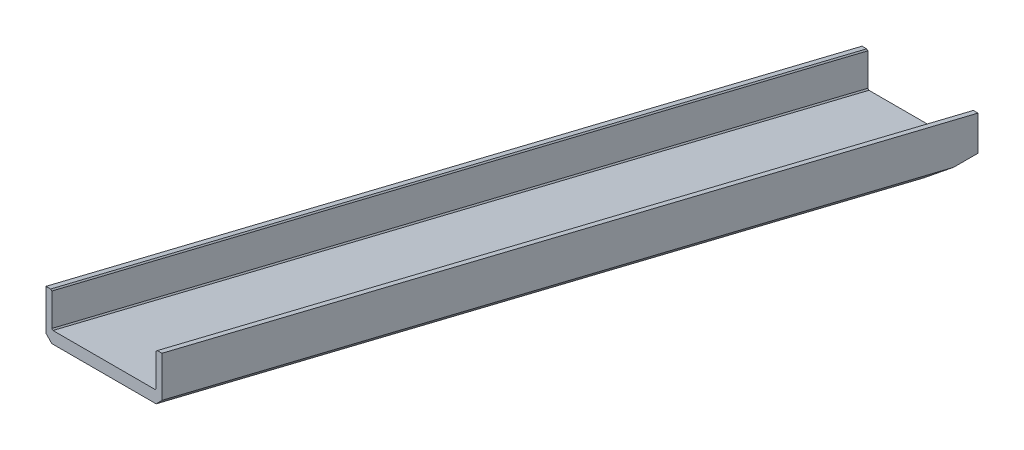
ISO-10303-21;
HEADER;
FILE_DESCRIPTION(('STEP AP214'),'2;1');
FILE_NAME('part.step','',(''),(''),'','','');
FILE_SCHEMA(('AUTOMOTIVE_DESIGN { 1 0 10303 214 1 1 1 1 }'));
ENDSEC;
DATA;
#1=APPLICATION_CONTEXT('core data for automotive mechanical design processes');
#2=APPLICATION_PROTOCOL_DEFINITION('international standard','automotive_design',2000,#1);
#3=PRODUCT_CONTEXT('',#1,'mechanical');
#4=PRODUCT('Part','Part','',(#3));
#5=PRODUCT_RELATED_PRODUCT_CATEGORY('part','',(#4));
#6=PRODUCT_DEFINITION_FORMATION('','',#4);
#7=PRODUCT_DEFINITION_CONTEXT('part definition',#1,'design');
#8=PRODUCT_DEFINITION('design','',#6,#7);
#9=PRODUCT_DEFINITION_SHAPE('','',#8);
#10=(LENGTH_UNIT() NAMED_UNIT(*) SI_UNIT(.MILLI.,.METRE.));
#11=(NAMED_UNIT(*) PLANE_ANGLE_UNIT() SI_UNIT($,.RADIAN.));
#12=(NAMED_UNIT(*) SI_UNIT($,.STERADIAN.) SOLID_ANGLE_UNIT());
#13=UNCERTAINTY_MEASURE_WITH_UNIT(LENGTH_MEASURE(1.E-05),#10,'distance_accuracy_value','');
#14=(GEOMETRIC_REPRESENTATION_CONTEXT(3) GLOBAL_UNCERTAINTY_ASSIGNED_CONTEXT((#13)) GLOBAL_UNIT_ASSIGNED_CONTEXT((#10,
#11,#12)) REPRESENTATION_CONTEXT('',''));
#15=CARTESIAN_POINT('',(0.,0.,0.));
#16=DIRECTION('',(0.,0.,1.));
#17=DIRECTION('',(1.,0.,0.));
#18=AXIS2_PLACEMENT_3D('',#15,#16,#17);
#19=CARTESIAN_POINT('',(450.,-4000.,2700.));
#20=DIRECTION('',(0.,-0.971250682234017,0.238059052043723));
#21=DIRECTION('',(0.,-0.238059052043723,-0.971250682234017));
#22=AXIS2_PLACEMENT_3D('',#19,#20,#21);
#23=PLANE('',#22);
#24=DIRECTION('',(-1.,0.,0.));
#25=VECTOR('',#24,1.);
#26=CARTESIAN_POINT('',(450.,-2274.99999999998,9737.7808046803));
#27=LINE('',#26,#25);
#28=CARTESIAN_POINT('',(439.999999999999,-2274.99999999998,9737.7808046803));
#29=VERTEX_POINT('',#28);
#30=CARTESIAN_POINT('',(-439.999999999999,-2274.99999999998,9737.7808046803));
#31=VERTEX_POINT('',#30);
#32=EDGE_CURVE('E287',#29,#31,#27,.T.);
#33=ORIENTED_EDGE('',*,*,#32,.F.);
#34=DIRECTION('',(0.,-0.238059052043723,-0.971250682234017));
#35=VECTOR('',#34,1.);
#36=CARTESIAN_POINT('',(439.999999999999,-4000.,2700.));
#37=LINE('',#36,#35);
#38=CARTESIAN_POINT('',(439.999999999999,-4000.,2700.));
#39=VERTEX_POINT('',#38);
#40=EDGE_CURVE('E294',#29,#39,#37,.T.);
#41=ORIENTED_EDGE('',*,*,#40,.T.);
#42=DIRECTION('',(-1.,0.,0.));
#43=VECTOR('',#42,1.);
#44=CARTESIAN_POINT('',(450.,-4000.,2700.));
#45=LINE('',#44,#43);
#46=CARTESIAN_POINT('',(-439.999999999999,-4000.,2700.));
#47=VERTEX_POINT('',#46);
#48=EDGE_CURVE('E278',#39,#47,#45,.T.);
#49=ORIENTED_EDGE('',*,*,#48,.T.);
#50=DIRECTION('',(0.,-0.238059052043723,-0.971250682234017));
#51=VECTOR('',#50,1.);
#52=CARTESIAN_POINT('',(-439.999999999999,-4000.,2700.));
#53=LINE('',#52,#51);
#54=EDGE_CURVE('E212',#31,#47,#53,.T.);
#55=ORIENTED_EDGE('',*,*,#54,.F.);
#56=EDGE_LOOP('',(#33,#41,#49,#55));
#57=FACE_BOUND('',#56,.T.);
#58=ADVANCED_FACE('F49',(#57),#23,.F.);
#59=CARTESIAN_POINT('',(450.,-2274.99999999998,9737.7808046803));
#60=DIRECTION('',(0.,0.,-1.));
#61=DIRECTION('',(-1.,0.,0.));
#62=AXIS2_PLACEMENT_3D('',#59,#60,#61);
#63=PLANE('',#62);
#64=DIRECTION('',(-1.,0.,0.));
#65=VECTOR('',#64,1.);
#66=CARTESIAN_POINT('',(500.,-1974.99999999998,9737.7808046803));
#67=LINE('',#66,#65);
#68=CARTESIAN_POINT('',(500.,-1974.99999999998,9737.7808046803));
#69=VERTEX_POINT('',#68);
#70=CARTESIAN_POINT('',(459.999999999999,-1974.99999999998,9737.7808046803));
#71=VERTEX_POINT('',#70);
#72=EDGE_CURVE('E264',#69,#71,#67,.T.);
#73=ORIENTED_EDGE('',*,*,#72,.T.);
#74=DIRECTION('',(0.696720028549396,0.71734315485556,0.));
#75=VECTOR('',#74,1.);
#76=CARTESIAN_POINT('',(-402.133167245435,-2862.65257313626,9737.7808046803));
#77=LINE('',#76,#75);
#78=CARTESIAN_POINT('',(450.,-1985.29600306378,9737.7808046803));
#79=VERTEX_POINT('',#78);
#80=EDGE_CURVE('E73',#71,#79,#77,.F.);
#81=ORIENTED_EDGE('',*,*,#80,.T.);
#82=DIRECTION('',(0.,-1.,0.));
#83=VECTOR('',#82,1.);
#84=CARTESIAN_POINT('',(450.,-1974.99999999998,9737.7808046803));
#85=LINE('',#84,#83);
#86=CARTESIAN_POINT('',(450.,-2264.70399693618,9737.7808046803));
#87=VERTEX_POINT('',#86);
#88=EDGE_CURVE('E254',#79,#87,#85,.T.);
#89=ORIENTED_EDGE('',*,*,#88,.T.);
#90=DIRECTION('',(0.696720028549376,0.71734315485558,0.));
#91=VECTOR('',#90,1.);
#92=CARTESIAN_POINT('',(444.854187981818,-2270.00212656667,9737.7808046803));
#93=LINE('',#92,#91);
#94=EDGE_CURVE('E298',#87,#29,#93,.F.);
#95=ORIENTED_EDGE('',*,*,#94,.T.);
#96=ORIENTED_EDGE('',*,*,#32,.T.);
#97=DIRECTION('',(-0.696720028549376,0.71734315485558,0.));
#98=VECTOR('',#97,1.);
#99=CARTESIAN_POINT('',(-444.854187981818,-2270.00212656667,9737.7808046803));
#100=LINE('',#99,#98);
#101=CARTESIAN_POINT('',(-450.,-2264.70399693618,9737.7808046803));
#102=VERTEX_POINT('',#101);
#103=EDGE_CURVE('E215',#102,#31,#100,.F.);
#104=ORIENTED_EDGE('',*,*,#103,.F.);
#105=DIRECTION('',(0.,-1.,0.));
#106=VECTOR('',#105,1.);
#107=CARTESIAN_POINT('',(-450.,-1974.99999999998,9737.7808046803));
#108=LINE('',#107,#106);
#109=CARTESIAN_POINT('',(-450.,-1985.29600306378,9737.7808046803));
#110=VERTEX_POINT('',#109);
#111=EDGE_CURVE('E188',#110,#102,#108,.T.);
#112=ORIENTED_EDGE('',*,*,#111,.F.);
#113=DIRECTION('',(-0.696720028549396,0.71734315485556,0.));
#114=VECTOR('',#113,1.);
#115=CARTESIAN_POINT('',(402.133167245435,-2862.65257313626,9737.7808046803));
#116=LINE('',#115,#114);
#117=CARTESIAN_POINT('',(-459.999999999999,-1974.99999999998,9737.7808046803));
#118=VERTEX_POINT('',#117);
#119=EDGE_CURVE('E237',#118,#110,#116,.F.);
#120=ORIENTED_EDGE('',*,*,#119,.F.);
#121=DIRECTION('',(1.,0.,0.));
#122=VECTOR('',#121,1.);
#123=CARTESIAN_POINT('',(-500.,-1974.99999999998,9737.7808046803));
#124=LINE('',#123,#122);
#125=CARTESIAN_POINT('',(-500.,-1974.99999999998,9737.7808046803));
#126=VERTEX_POINT('',#125);
#127=EDGE_CURVE('E201',#126,#118,#124,.T.);
#128=ORIENTED_EDGE('',*,*,#127,.F.);
#129=DIRECTION('',(0.,-1.,0.));
#130=VECTOR('',#129,1.);
#131=CARTESIAN_POINT('',(-500.,-1974.99999999998,9737.7808046803));
#132=LINE('',#131,#130);
#133=CARTESIAN_POINT('',(-500.,-2326.48001531898,9737.7808046803));
#134=VERTEX_POINT('',#133);
#135=EDGE_CURVE('E197',#126,#134,#132,.T.);
#136=ORIENTED_EDGE('',*,*,#135,.T.);
#137=DIRECTION('',(-0.69672002854938,0.717343154855576,0.));
#138=VECTOR('',#137,1.);
#139=CARTESIAN_POINT('',(559.386544490562,-3417.22472610139,9737.7808046803));
#140=LINE('',#139,#138);
#141=CARTESIAN_POINT('',(-450.000000000002,-2377.96003063799,9737.7808046803));
#142=VERTEX_POINT('',#141);
#143=EDGE_CURVE('E230',#142,#134,#140,.T.);
#144=ORIENTED_EDGE('',*,*,#143,.F.);
#145=DIRECTION('',(-1.,0.,0.));
#146=VECTOR('',#145,1.);
#147=CARTESIAN_POINT('',(450.,-2377.96003063799,9737.7808046803));
#148=LINE('',#147,#146);
#149=CARTESIAN_POINT('',(450.000000000002,-2377.96003063799,9737.7808046803));
#150=VERTEX_POINT('',#149);
#151=EDGE_CURVE('E284',#150,#142,#148,.T.);
#152=ORIENTED_EDGE('',*,*,#151,.F.);
#153=DIRECTION('',(0.69672002854938,0.717343154855576,0.));
#154=VECTOR('',#153,1.);
#155=CARTESIAN_POINT('',(-559.386544490562,-3417.22472610139,9737.7808046803));
#156=LINE('',#155,#154);
#157=CARTESIAN_POINT('',(500.,-2326.48001531898,9737.7808046803));
#158=VERTEX_POINT('',#157);
#159=EDGE_CURVE('E314',#150,#158,#156,.T.);
#160=ORIENTED_EDGE('',*,*,#159,.T.);
#161=DIRECTION('',(0.,-1.,0.));
#162=VECTOR('',#161,1.);
#163=CARTESIAN_POINT('',(500.,-1974.99999999998,9737.7808046803));
#164=LINE('',#163,#162);
#165=EDGE_CURVE('E260',#69,#158,#164,.T.);
#166=ORIENTED_EDGE('',*,*,#165,.F.);
#167=EDGE_LOOP('',(#73,#81,#89,#95,#96,#104,#112,#120,#128,#136,#144,#152,#160,#166));
#168=FACE_BOUND('',#167,.T.);
#169=ADVANCED_FACE('F332',(#168),#63,.F.);
#170=CARTESIAN_POINT('',(450.,-2377.96003063799,9737.7808046803));
#171=DIRECTION('',(0.,0.971250682234017,-0.238059052043723));
#172=DIRECTION('',(0.,0.238059052043723,0.971250682234017));
#173=AXIS2_PLACEMENT_3D('',#170,#171,#172);
#174=PLANE('',#173);
#175=DIRECTION('',(-1.,0.,0.));
#176=VECTOR('',#175,1.);
#177=CARTESIAN_POINT('',(450.,-4000.,3120.06384189765));
#178=LINE('',#177,#176);
#179=CARTESIAN_POINT('',(450.000000000002,-4000.,3120.06384189765));
#180=VERTEX_POINT('',#179);
#181=CARTESIAN_POINT('',(-450.000000000002,-4000.,3120.06384189765));
#182=VERTEX_POINT('',#181);
#183=EDGE_CURVE('E281',#180,#182,#178,.T.);
#184=ORIENTED_EDGE('',*,*,#183,.F.);
#185=DIRECTION('',(0.,0.238059052043723,0.971250682234017));
#186=VECTOR('',#185,1.);
#187=CARTESIAN_POINT('',(450.000000000002,-2377.96003063798,9737.7808046803));
#188=LINE('',#187,#186);
#189=EDGE_CURVE('E311',#180,#150,#188,.T.);
#190=ORIENTED_EDGE('',*,*,#189,.T.);
#191=ORIENTED_EDGE('',*,*,#151,.T.);
#192=DIRECTION('',(0.,0.238059052043723,0.971250682234017));
#193=VECTOR('',#192,1.);
#194=CARTESIAN_POINT('',(-450.000000000002,-2377.96003063798,9737.7808046803));
#195=LINE('',#194,#193);
#196=EDGE_CURVE('E226',#182,#142,#195,.T.);
#197=ORIENTED_EDGE('',*,*,#196,.F.);
#198=EDGE_LOOP('',(#184,#190,#191,#197));
#199=FACE_BOUND('',#198,.T.);
#200=ADVANCED_FACE('F345',(#199),#174,.F.);
#201=CARTESIAN_POINT('',(450.,-4000.,3120.06384189765));
#202=DIRECTION('',(0.,1.,0.));
#203=DIRECTION('',(0.,0.,1.));
#204=AXIS2_PLACEMENT_3D('',#201,#202,#203);
#205=PLANE('',#204);
#206=DIRECTION('',(0.,0.,-1.));
#207=VECTOR('',#206,1.);
#208=CARTESIAN_POINT('',(500.,-4000.,3120.06384189765));
#209=LINE('',#208,#207);
#210=CARTESIAN_POINT('',(500.,-4000.,2910.03192094883));
#211=VERTEX_POINT('',#210);
#212=CARTESIAN_POINT('',(500.,-4000.,2700.));
#213=VERTEX_POINT('',#212);
#214=EDGE_CURVE('E250',#211,#213,#209,.T.);
#215=ORIENTED_EDGE('',*,*,#214,.F.);
#216=DIRECTION('',(-0.231587213402984,0.,0.972814145964295));
#217=VECTOR('',#216,1.);
#218=CARTESIAN_POINT('',(910.087466039574,-4000.,1187.40275596226));
#219=LINE('',#218,#217);
#220=EDGE_CURVE('E308',#211,#180,#219,.T.);
#221=ORIENTED_EDGE('',*,*,#220,.T.);
#222=ORIENTED_EDGE('',*,*,#183,.T.);
#223=DIRECTION('',(0.231587213402984,0.,0.972814145964295));
#224=VECTOR('',#223,1.);
#225=CARTESIAN_POINT('',(-910.087466039574,-4000.,1187.40275596226));
#226=LINE('',#225,#224);
#227=CARTESIAN_POINT('',(-500.,-4000.,2910.03192094883));
#228=VERTEX_POINT('',#227);
#229=EDGE_CURVE('E186',#228,#182,#226,.T.);
#230=ORIENTED_EDGE('',*,*,#229,.F.);
#231=DIRECTION('',(0.,0.,-1.));
#232=VECTOR('',#231,1.);
#233=CARTESIAN_POINT('',(-500.,-4000.,3120.06384189765));
#234=LINE('',#233,#232);
#235=CARTESIAN_POINT('',(-500.,-4000.,2700.));
#236=VERTEX_POINT('',#235);
#237=EDGE_CURVE('E162',#228,#236,#234,.T.);
#238=ORIENTED_EDGE('',*,*,#237,.T.);
#239=DIRECTION('',(1.,0.,0.));
#240=VECTOR('',#239,1.);
#241=CARTESIAN_POINT('',(-500.,-4000.,2700.));
#242=LINE('',#241,#240);
#243=EDGE_CURVE('E171',#236,#47,#242,.T.);
#244=ORIENTED_EDGE('',*,*,#243,.T.);
#245=ORIENTED_EDGE('',*,*,#48,.F.);
#246=DIRECTION('',(-1.,0.,0.));
#247=VECTOR('',#246,1.);
#248=CARTESIAN_POINT('',(500.,-4000.,2700.));
#249=LINE('',#248,#247);
#250=EDGE_CURVE('E275',#213,#39,#249,.T.);
#251=ORIENTED_EDGE('',*,*,#250,.F.);
#252=EDGE_LOOP('',(#215,#221,#222,#230,#238,#244,#245,#251));
#253=FACE_BOUND('',#252,.T.);
#254=ADVANCED_FACE('F184',(#253),#205,.F.);
#255=CARTESIAN_POINT('',(450.,0.,0.));
#256=DIRECTION('',(1.,0.,0.));
#257=DIRECTION('',(0.,0.,-1.));
#258=AXIS2_PLACEMENT_3D('',#255,#256,#257);
#259=PLANE('',#258);
#260=ORIENTED_EDGE('',*,*,#88,.F.);
#261=DIRECTION('',(0.,-0.238059052043723,-0.971250682234017));
#262=VECTOR('',#261,1.);
#263=CARTESIAN_POINT('',(450.,-4124.30623657601,1010.89085544728));
#264=LINE('',#263,#262);
#265=CARTESIAN_POINT('',(450.,-3710.2960030638,2700.));
#266=VERTEX_POINT('',#265);
#267=EDGE_CURVE('E59',#79,#266,#264,.T.);
#268=ORIENTED_EDGE('',*,*,#267,.T.);
#269=DIRECTION('',(0.,1.,0.));
#270=VECTOR('',#269,1.);
#271=CARTESIAN_POINT('',(450.,-4000.,2700.));
#272=LINE('',#271,#270);
#273=CARTESIAN_POINT('',(450.,-3989.7039969362,2700.));
#274=VERTEX_POINT('',#273);
#275=EDGE_CURVE('E249',#274,#266,#272,.T.);
#276=ORIENTED_EDGE('',*,*,#275,.F.);
#277=DIRECTION('',(0.,0.238059052043723,0.971250682234017));
#278=VECTOR('',#277,1.);
#279=CARTESIAN_POINT('',(450.,-2265.28749317764,9735.40021415986));
#280=LINE('',#279,#278);
#281=EDGE_CURVE('E290',#274,#87,#280,.T.);
#282=ORIENTED_EDGE('',*,*,#281,.T.);
#283=EDGE_LOOP('',(#260,#268,#276,#282));
#284=FACE_BOUND('',#283,.T.);
#285=ADVANCED_FACE('F374',(#284),#259,.F.);
#286=CARTESIAN_POINT('',(500.,-4000.,2700.));
#287=DIRECTION('',(0.,0.,1.));
#288=DIRECTION('',(1.,0.,0.));
#289=AXIS2_PLACEMENT_3D('',#286,#287,#288);
#290=PLANE('',#289);
#291=ORIENTED_EDGE('',*,*,#275,.T.);
#292=DIRECTION('',(-0.696720028549396,-0.71734315485556,0.));
#293=VECTOR('',#292,1.);
#294=CARTESIAN_POINT('',(459.999999999999,-3700.,2700.));
#295=LINE('',#294,#293);
#296=CARTESIAN_POINT('',(459.999999999999,-3700.,2700.));
#297=VERTEX_POINT('',#296);
#298=EDGE_CURVE('E11',#266,#297,#295,.F.);
#299=ORIENTED_EDGE('',*,*,#298,.T.);
#300=DIRECTION('',(-1.,0.,0.));
#301=VECTOR('',#300,1.);
#302=CARTESIAN_POINT('',(500.,-3700.,2700.));
#303=LINE('',#302,#301);
#304=CARTESIAN_POINT('',(500.,-3700.,2700.));
#305=VERTEX_POINT('',#304);
#306=EDGE_CURVE('E271',#305,#297,#303,.T.);
#307=ORIENTED_EDGE('',*,*,#306,.F.);
#308=DIRECTION('',(0.,1.,0.));
#309=VECTOR('',#308,1.);
#310=CARTESIAN_POINT('',(500.,-4000.,2700.));
#311=LINE('',#310,#309);
#312=EDGE_CURVE('E253',#213,#305,#311,.T.);
#313=ORIENTED_EDGE('',*,*,#312,.F.);
#314=ORIENTED_EDGE('',*,*,#250,.T.);
#315=DIRECTION('',(-0.696720028549376,-0.71734315485558,0.));
#316=VECTOR('',#315,1.);
#317=CARTESIAN_POINT('',(469.12512789091,-3970.01275940016,2700.));
#318=LINE('',#317,#316);
#319=EDGE_CURVE('E301',#39,#274,#318,.F.);
#320=ORIENTED_EDGE('',*,*,#319,.T.);
#321=EDGE_LOOP('',(#291,#299,#307,#313,#314,#320));
#322=FACE_BOUND('',#321,.T.);
#323=ADVANCED_FACE('F372',(#322),#290,.F.);
#324=CARTESIAN_POINT('',(500.,-3700.,2700.));
#325=DIRECTION('',(0.,-0.971250682234017,0.238059052043723));
#326=DIRECTION('',(0.,-0.238059052043723,-0.971250682234017));
#327=AXIS2_PLACEMENT_3D('',#324,#325,#326);
#328=PLANE('',#327);
#329=ORIENTED_EDGE('',*,*,#306,.T.);
#330=DIRECTION('',(0.,0.238059052043723,0.971250682234017));
#331=VECTOR('',#330,1.);
#332=CARTESIAN_POINT('',(459.999999999999,-3700.,2700.));
#333=LINE('',#332,#331);
#334=EDGE_CURVE('E317',#297,#71,#333,.T.);
#335=ORIENTED_EDGE('',*,*,#334,.T.);
#336=ORIENTED_EDGE('',*,*,#72,.F.);
#337=DIRECTION('',(0.,0.238059052043723,0.971250682234017));
#338=VECTOR('',#337,1.);
#339=CARTESIAN_POINT('',(500.,-3700.,2700.));
#340=LINE('',#339,#338);
#341=EDGE_CURVE('E257',#305,#69,#340,.T.);
#342=ORIENTED_EDGE('',*,*,#341,.F.);
#343=EDGE_LOOP('',(#329,#335,#336,#342));
#344=FACE_BOUND('',#343,.T.);
#345=ADVANCED_FACE('F326',(#344),#328,.F.);
#346=CARTESIAN_POINT('',(500.,0.,0.));
#347=DIRECTION('',(1.,0.,0.));
#348=DIRECTION('',(0.,0.,-1.));
#349=AXIS2_PLACEMENT_3D('',#346,#347,#348);
#350=PLANE('',#349);
#351=ORIENTED_EDGE('',*,*,#165,.T.);
#352=DIRECTION('',(0.,-0.238059052043723,-0.971250682234017));
#353=VECTOR('',#352,1.);
#354=CARTESIAN_POINT('',(500.,-3951.4374658883,3108.16088929547));
#355=LINE('',#354,#353);
#356=EDGE_CURVE('E304',#158,#211,#355,.T.);
#357=ORIENTED_EDGE('',*,*,#356,.T.);
#358=ORIENTED_EDGE('',*,*,#214,.T.);
#359=ORIENTED_EDGE('',*,*,#312,.T.);
#360=ORIENTED_EDGE('',*,*,#341,.T.);
#361=EDGE_LOOP('',(#351,#357,#358,#359,#360));
#362=FACE_BOUND('',#361,.T.);
#363=ADVANCED_FACE('F337',(#362),#350,.T.);
#364=CARTESIAN_POINT('',(450.,-4387.87958925335,1075.49417941924));
#365=DIRECTION('',(-0.707106781186551,0.68677794363973,-0.168333170022957));
#366=DIRECTION('',(0.,-0.238059052043723,-0.971250682234017));
#367=AXIS2_PLACEMENT_3D('',#364,#365,#366);
#368=PLANE('',#367);
#369=ORIENTED_EDGE('',*,*,#319,.F.);
#370=ORIENTED_EDGE('',*,*,#40,.F.);
#371=ORIENTED_EDGE('',*,*,#94,.F.);
#372=ORIENTED_EDGE('',*,*,#281,.F.);
#373=EDGE_LOOP('',(#369,#370,#371,#372));
#374=FACE_BOUND('',#373,.T.);
#375=ADVANCED_FACE('F369',(#374),#368,.T.);
#376=CARTESIAN_POINT('',(500.,-4446.15463018739,1089.77772254186));
#377=DIRECTION('',(0.707106781186548,-0.686777943639734,0.168333170022958));
#378=DIRECTION('',(0.,0.238059052043723,0.971250682234017));
#379=AXIS2_PLACEMENT_3D('',#376,#377,#378);
#380=PLANE('',#379);
#381=ORIENTED_EDGE('',*,*,#159,.F.);
#382=ORIENTED_EDGE('',*,*,#189,.F.);
#383=ORIENTED_EDGE('',*,*,#220,.F.);
#384=ORIENTED_EDGE('',*,*,#356,.F.);
#385=EDGE_LOOP('',(#381,#382,#383,#384));
#386=FACE_BOUND('',#385,.T.);
#387=ADVANCED_FACE('F339',(#386),#380,.T.);
#388=CARTESIAN_POINT('',(459.999999999999,-3700.,2700.));
#389=DIRECTION('',(0.707106781186532,-0.68677794363975,0.168333170022961));
#390=DIRECTION('',(0.,0.238059052043723,0.971250682234017));
#391=AXIS2_PLACEMENT_3D('',#388,#389,#390);
#392=PLANE('',#391);
#393=ORIENTED_EDGE('',*,*,#298,.F.);
#394=ORIENTED_EDGE('',*,*,#267,.F.);
#395=ORIENTED_EDGE('',*,*,#80,.F.);
#396=ORIENTED_EDGE('',*,*,#334,.F.);
#397=EDGE_LOOP('',(#393,#394,#395,#396));
#398=FACE_BOUND('',#397,.T.);
#399=ADVANCED_FACE('F52',(#398),#392,.F.);
#400=CARTESIAN_POINT('',(-450.,0.,0.));
#401=DIRECTION('',(-1.,0.,0.));
#402=DIRECTION('',(0.,0.,-1.));
#403=AXIS2_PLACEMENT_3D('',#400,#401,#402);
#404=PLANE('',#403);
#405=ORIENTED_EDGE('',*,*,#111,.T.);
#406=DIRECTION('',(0.,0.238059052043723,0.971250682234017));
#407=VECTOR('',#406,1.);
#408=CARTESIAN_POINT('',(-450.,-2265.28749317764,9735.40021415986));
#409=LINE('',#408,#407);
#410=CARTESIAN_POINT('',(-450.,-3989.7039969362,2700.));
#411=VERTEX_POINT('',#410);
#412=EDGE_CURVE('E179',#411,#102,#409,.T.);
#413=ORIENTED_EDGE('',*,*,#412,.F.);
#414=DIRECTION('',(0.,1.,0.));
#415=VECTOR('',#414,1.);
#416=CARTESIAN_POINT('',(-450.,-4000.,2700.));
#417=LINE('',#416,#415);
#418=CARTESIAN_POINT('',(-450.,-3710.2960030638,2700.));
#419=VERTEX_POINT('',#418);
#420=EDGE_CURVE('E192',#411,#419,#417,.T.);
#421=ORIENTED_EDGE('',*,*,#420,.T.);
#422=DIRECTION('',(0.,-0.238059052043723,-0.971250682234017));
#423=VECTOR('',#422,1.);
#424=CARTESIAN_POINT('',(-450.,-4124.30623657601,1010.89085544728));
#425=LINE('',#424,#423);
#426=EDGE_CURVE('E241',#110,#419,#425,.T.);
#427=ORIENTED_EDGE('',*,*,#426,.F.);
#428=EDGE_LOOP('',(#405,#413,#421,#427));
#429=FACE_BOUND('',#428,.T.);
#430=ADVANCED_FACE('F358',(#429),#404,.F.);
#431=CARTESIAN_POINT('',(-500.,-4000.,2700.));
#432=DIRECTION('',(0.,0.,1.));
#433=DIRECTION('',(-1.,0.,0.));
#434=AXIS2_PLACEMENT_3D('',#431,#432,#433);
#435=PLANE('',#434);
#436=ORIENTED_EDGE('',*,*,#420,.F.);
#437=DIRECTION('',(0.696720028549376,-0.71734315485558,0.));
#438=VECTOR('',#437,1.);
#439=CARTESIAN_POINT('',(-469.12512789091,-3970.01275940016,2700.));
#440=LINE('',#439,#438);
#441=EDGE_CURVE('E174',#47,#411,#440,.F.);
#442=ORIENTED_EDGE('',*,*,#441,.F.);
#443=ORIENTED_EDGE('',*,*,#243,.F.);
#444=DIRECTION('',(0.,1.,0.));
#445=VECTOR('',#444,1.);
#446=CARTESIAN_POINT('',(-500.,-4000.,2700.));
#447=LINE('',#446,#445);
#448=CARTESIAN_POINT('',(-500.,-3700.,2700.));
#449=VERTEX_POINT('',#448);
#450=EDGE_CURVE('E157',#236,#449,#447,.T.);
#451=ORIENTED_EDGE('',*,*,#450,.T.);
#452=DIRECTION('',(1.,0.,0.));
#453=VECTOR('',#452,1.);
#454=CARTESIAN_POINT('',(-500.,-3700.,2700.));
#455=LINE('',#454,#453);
#456=CARTESIAN_POINT('',(-459.999999999999,-3700.,2700.));
#457=VERTEX_POINT('',#456);
#458=EDGE_CURVE('E180',#449,#457,#455,.T.);
#459=ORIENTED_EDGE('',*,*,#458,.T.);
#460=DIRECTION('',(0.696720028549396,-0.71734315485556,0.));
#461=VECTOR('',#460,1.);
#462=CARTESIAN_POINT('',(-459.999999999999,-3700.,2700.));
#463=LINE('',#462,#461);
#464=EDGE_CURVE('E245',#419,#457,#463,.F.);
#465=ORIENTED_EDGE('',*,*,#464,.F.);
#466=EDGE_LOOP('',(#436,#442,#443,#451,#459,#465));
#467=FACE_BOUND('',#466,.T.);
#468=ADVANCED_FACE('F173',(#467),#435,.F.);
#469=CARTESIAN_POINT('',(-500.,-3700.,2700.));
#470=DIRECTION('',(0.,-0.971250682234017,0.238059052043723));
#471=DIRECTION('',(0.,-0.238059052043723,-0.971250682234017));
#472=AXIS2_PLACEMENT_3D('',#469,#470,#471);
#473=PLANE('',#472);
#474=ORIENTED_EDGE('',*,*,#458,.F.);
#475=DIRECTION('',(0.,0.238059052043723,0.971250682234017));
#476=VECTOR('',#475,1.);
#477=CARTESIAN_POINT('',(-500.,-3700.,2700.));
#478=LINE('',#477,#476);
#479=EDGE_CURVE('E163',#449,#126,#478,.T.);
#480=ORIENTED_EDGE('',*,*,#479,.T.);
#481=ORIENTED_EDGE('',*,*,#127,.T.);
#482=DIRECTION('',(0.,0.238059052043723,0.971250682234017));
#483=VECTOR('',#482,1.);
#484=CARTESIAN_POINT('',(-459.999999999999,-3700.,2700.));
#485=LINE('',#484,#483);
#486=EDGE_CURVE('E234',#457,#118,#485,.T.);
#487=ORIENTED_EDGE('',*,*,#486,.F.);
#488=EDGE_LOOP('',(#474,#480,#481,#487));
#489=FACE_BOUND('',#488,.T.);
#490=ADVANCED_FACE('F353',(#489),#473,.F.);
#491=CARTESIAN_POINT('',(-500.,0.,0.));
#492=DIRECTION('',(-1.,0.,0.));
#493=DIRECTION('',(0.,0.,-1.));
#494=AXIS2_PLACEMENT_3D('',#491,#492,#493);
#495=PLANE('',#494);
#496=ORIENTED_EDGE('',*,*,#135,.F.);
#497=ORIENTED_EDGE('',*,*,#479,.F.);
#498=ORIENTED_EDGE('',*,*,#450,.F.);
#499=ORIENTED_EDGE('',*,*,#237,.F.);
#500=DIRECTION('',(0.,-0.238059052043723,-0.971250682234017));
#501=VECTOR('',#500,1.);
#502=CARTESIAN_POINT('',(-500.,-3951.4374658883,3108.16088929547));
#503=LINE('',#502,#501);
#504=EDGE_CURVE('E221',#134,#228,#503,.T.);
#505=ORIENTED_EDGE('',*,*,#504,.F.);
#506=EDGE_LOOP('',(#496,#497,#498,#499,#505));
#507=FACE_BOUND('',#506,.T.);
#508=ADVANCED_FACE('F160',(#507),#495,.T.);
#509=CARTESIAN_POINT('',(-450.,-4387.87958925335,1075.49417941924));
#510=DIRECTION('',(0.707106781186551,0.68677794363973,-0.168333170022957));
#511=DIRECTION('',(0.,-0.238059052043723,-0.971250682234017));
#512=AXIS2_PLACEMENT_3D('',#509,#510,#511);
#513=PLANE('',#512);
#514=ORIENTED_EDGE('',*,*,#441,.T.);
#515=ORIENTED_EDGE('',*,*,#412,.T.);
#516=ORIENTED_EDGE('',*,*,#103,.T.);
#517=ORIENTED_EDGE('',*,*,#54,.T.);
#518=EDGE_LOOP('',(#514,#515,#516,#517));
#519=FACE_BOUND('',#518,.T.);
#520=ADVANCED_FACE('F361',(#519),#513,.T.);
#521=CARTESIAN_POINT('',(-500.,-4446.15463018739,1089.77772254186));
#522=DIRECTION('',(-0.707106781186548,-0.686777943639734,0.168333170022958));
#523=DIRECTION('',(0.,0.238059052043723,0.971250682234017));
#524=AXIS2_PLACEMENT_3D('',#521,#522,#523);
#525=PLANE('',#524);
#526=ORIENTED_EDGE('',*,*,#143,.T.);
#527=ORIENTED_EDGE('',*,*,#504,.T.);
#528=ORIENTED_EDGE('',*,*,#229,.T.);
#529=ORIENTED_EDGE('',*,*,#196,.T.);
#530=EDGE_LOOP('',(#526,#527,#528,#529));
#531=FACE_BOUND('',#530,.T.);
#532=ADVANCED_FACE('F348',(#531),#525,.T.);
#533=CARTESIAN_POINT('',(-459.999999999999,-3700.,2700.));
#534=DIRECTION('',(-0.707106781186532,-0.68677794363975,0.168333170022961));
#535=DIRECTION('',(0.,0.238059052043723,0.971250682234017));
#536=AXIS2_PLACEMENT_3D('',#533,#534,#535);
#537=PLANE('',#536);
#538=ORIENTED_EDGE('',*,*,#464,.T.);
#539=ORIENTED_EDGE('',*,*,#486,.T.);
#540=ORIENTED_EDGE('',*,*,#119,.T.);
#541=ORIENTED_EDGE('',*,*,#426,.T.);
#542=EDGE_LOOP('',(#538,#539,#540,#541));
#543=FACE_BOUND('',#542,.T.);
#544=ADVANCED_FACE('F356',(#543),#537,.F.);
#545=CLOSED_SHELL('',(#58,#169,#200,#254,#285,#323,#345,#363,#375,#387,#399,#430,#468,#490,#508,
#520,#532,#544));
#546=MANIFOLD_SOLID_BREP('B2',#545);
#547=ADVANCED_BREP_SHAPE_REPRESENTATION('',(#18,#546),#14);
#548=SHAPE_DEFINITION_REPRESENTATION(#9,#547);
ENDSEC;
END-ISO-10303-21;
